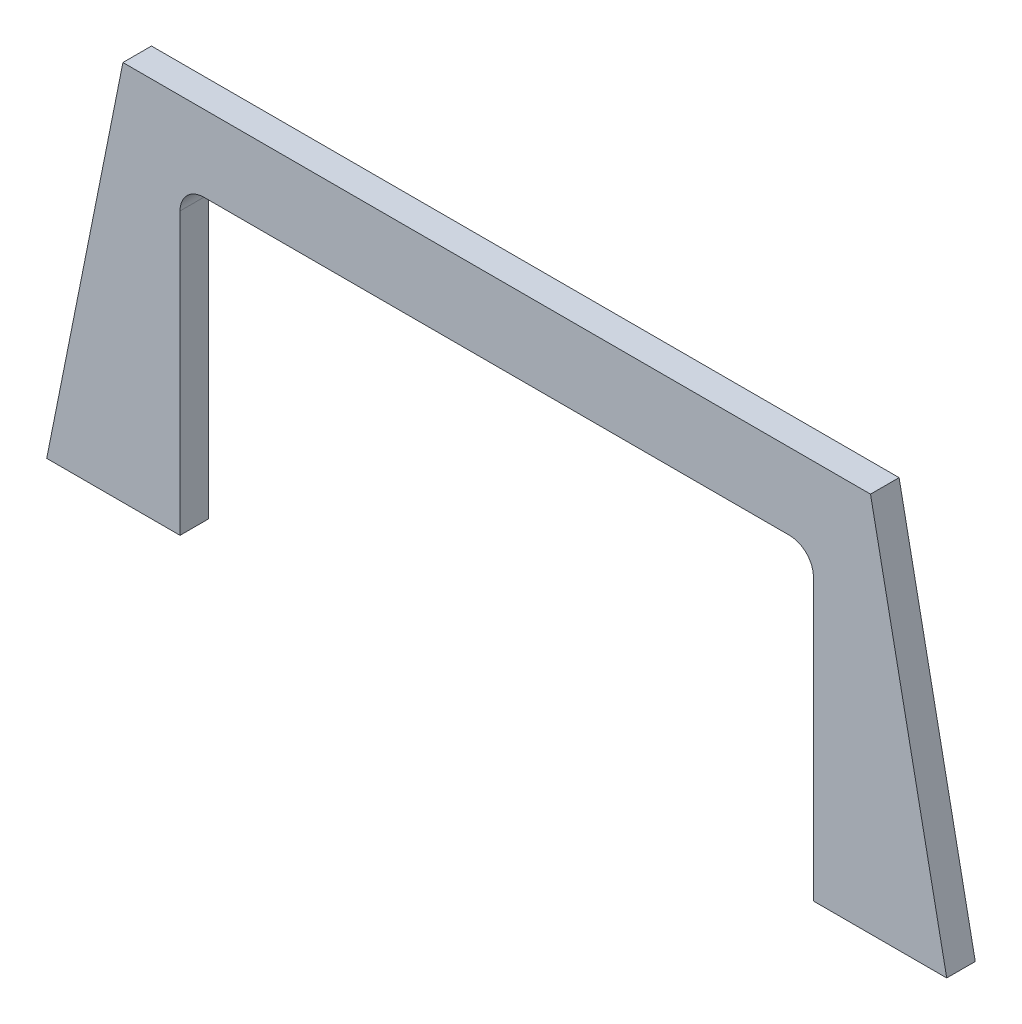
ISO-10303-21;
HEADER;
FILE_DESCRIPTION(('STEP AP214'),'2;1');
FILE_NAME('part.step','',(''),(''),'','','');
FILE_SCHEMA(('AUTOMOTIVE_DESIGN { 1 0 10303 214 1 1 1 1 }'));
ENDSEC;
DATA;
#1=APPLICATION_CONTEXT('core data for automotive mechanical design processes');
#2=APPLICATION_PROTOCOL_DEFINITION('international standard','automotive_design',2000,#1);
#3=PRODUCT_CONTEXT('',#1,'mechanical');
#4=PRODUCT('Part','Part','',(#3));
#5=PRODUCT_RELATED_PRODUCT_CATEGORY('part','',(#4));
#6=PRODUCT_DEFINITION_FORMATION('','',#4);
#7=PRODUCT_DEFINITION_CONTEXT('part definition',#1,'design');
#8=PRODUCT_DEFINITION('design','',#6,#7);
#9=PRODUCT_DEFINITION_SHAPE('','',#8);
#10=(LENGTH_UNIT() NAMED_UNIT(*) SI_UNIT(.MILLI.,.METRE.));
#11=(NAMED_UNIT(*) PLANE_ANGLE_UNIT() SI_UNIT($,.RADIAN.));
#12=(NAMED_UNIT(*) SI_UNIT($,.STERADIAN.) SOLID_ANGLE_UNIT());
#13=UNCERTAINTY_MEASURE_WITH_UNIT(LENGTH_MEASURE(1.E-05),#10,'distance_accuracy_value','');
#14=(GEOMETRIC_REPRESENTATION_CONTEXT(3) GLOBAL_UNCERTAINTY_ASSIGNED_CONTEXT((#13)) GLOBAL_UNIT_ASSIGNED_CONTEXT((#10,
#11,#12)) REPRESENTATION_CONTEXT('',''));
#15=CARTESIAN_POINT('',(0.,0.,0.));
#16=DIRECTION('',(0.,0.,1.));
#17=DIRECTION('',(1.,0.,0.));
#18=AXIS2_PLACEMENT_3D('',#15,#16,#17);
#19=CARTESIAN_POINT('',(61.5,19.,6.));
#20=DIRECTION('',(0.,0.,-1.));
#21=DIRECTION('',(-1.,0.,0.));
#22=AXIS2_PLACEMENT_3D('',#19,#20,#21);
#23=CYLINDRICAL_SURFACE('',#22,5.);
#24=CARTESIAN_POINT('',(61.5,19.,0.));
#25=DIRECTION('',(0.,0.,-1.));
#26=DIRECTION('',(-1.,0.,0.));
#27=AXIS2_PLACEMENT_3D('',#24,#25,#26);
#28=CIRCLE('',#27,5.);
#29=CARTESIAN_POINT('',(61.5,24.,0.));
#30=VERTEX_POINT('',#29);
#31=CARTESIAN_POINT('',(66.5,19.,0.));
#32=VERTEX_POINT('',#31);
#33=EDGE_CURVE('E140',#30,#32,#28,.T.);
#34=ORIENTED_EDGE('',*,*,#33,.T.);
#35=DIRECTION('',(0.,0.,-1.));
#36=VECTOR('',#35,1.);
#37=CARTESIAN_POINT('',(66.5,19.,6.));
#38=LINE('',#37,#36);
#39=CARTESIAN_POINT('',(66.5,19.,6.));
#40=VERTEX_POINT('',#39);
#41=EDGE_CURVE('E11',#40,#32,#38,.T.);
#42=ORIENTED_EDGE('',*,*,#41,.F.);
#43=CARTESIAN_POINT('',(61.5,19.,6.));
#44=DIRECTION('',(0.,0.,-1.));
#45=DIRECTION('',(-1.,0.,0.));
#46=AXIS2_PLACEMENT_3D('',#43,#44,#45);
#47=CIRCLE('',#46,5.);
#48=CARTESIAN_POINT('',(61.5,24.,6.));
#49=VERTEX_POINT('',#48);
#50=EDGE_CURVE('E158',#49,#40,#47,.T.);
#51=ORIENTED_EDGE('',*,*,#50,.F.);
#52=DIRECTION('',(0.,0.,-1.));
#53=VECTOR('',#52,1.);
#54=CARTESIAN_POINT('',(61.5,24.,6.));
#55=LINE('',#54,#53);
#56=EDGE_CURVE('E136',#49,#30,#55,.T.);
#57=ORIENTED_EDGE('',*,*,#56,.T.);
#58=EDGE_LOOP('',(#34,#42,#51,#57));
#59=FACE_BOUND('',#58,.T.);
#60=ADVANCED_FACE('F32',(#59),#23,.F.);
#61=CARTESIAN_POINT('',(66.5,-40.,6.));
#62=DIRECTION('',(1.,0.,0.));
#63=DIRECTION('',(0.,1.,0.));
#64=AXIS2_PLACEMENT_3D('',#61,#62,#63);
#65=PLANE('',#64);
#66=DIRECTION('',(0.,-1.,0.));
#67=VECTOR('',#66,1.);
#68=CARTESIAN_POINT('',(66.5,-40.,0.));
#69=LINE('',#68,#67);
#70=CARTESIAN_POINT('',(66.5,-40.,0.));
#71=VERTEX_POINT('',#70);
#72=EDGE_CURVE('E143',#32,#71,#69,.T.);
#73=ORIENTED_EDGE('',*,*,#72,.T.);
#74=DIRECTION('',(0.,0.,-1.));
#75=VECTOR('',#74,1.);
#76=CARTESIAN_POINT('',(66.5,-40.,6.));
#77=LINE('',#76,#75);
#78=CARTESIAN_POINT('',(66.5,-40.,6.));
#79=VERTEX_POINT('',#78);
#80=EDGE_CURVE('E40',#79,#71,#77,.T.);
#81=ORIENTED_EDGE('',*,*,#80,.F.);
#82=DIRECTION('',(0.,-1.,0.));
#83=VECTOR('',#82,1.);
#84=CARTESIAN_POINT('',(66.5,-40.,6.));
#85=LINE('',#84,#83);
#86=EDGE_CURVE('E97',#40,#79,#85,.T.);
#87=ORIENTED_EDGE('',*,*,#86,.F.);
#88=ORIENTED_EDGE('',*,*,#41,.T.);
#89=EDGE_LOOP('',(#73,#81,#87,#88));
#90=FACE_BOUND('',#89,.T.);
#91=ADVANCED_FACE('F207',(#90),#65,.F.);
#92=CARTESIAN_POINT('',(94.5,-40.,6.));
#93=DIRECTION('',(0.,1.,0.));
#94=DIRECTION('',(0.,0.,1.));
#95=AXIS2_PLACEMENT_3D('',#92,#93,#94);
#96=PLANE('',#95);
#97=DIRECTION('',(1.,0.,0.));
#98=VECTOR('',#97,1.);
#99=CARTESIAN_POINT('',(94.5,-40.,0.));
#100=LINE('',#99,#98);
#101=CARTESIAN_POINT('',(94.5,-40.,0.));
#102=VERTEX_POINT('',#101);
#103=EDGE_CURVE('E145',#71,#102,#100,.T.);
#104=ORIENTED_EDGE('',*,*,#103,.T.);
#105=DIRECTION('',(0.,0.,-1.));
#106=VECTOR('',#105,1.);
#107=CARTESIAN_POINT('',(94.5,-40.,6.));
#108=LINE('',#107,#106);
#109=CARTESIAN_POINT('',(94.5,-40.,6.));
#110=VERTEX_POINT('',#109);
#111=EDGE_CURVE('E171',#110,#102,#108,.T.);
#112=ORIENTED_EDGE('',*,*,#111,.F.);
#113=DIRECTION('',(1.,0.,0.));
#114=VECTOR('',#113,1.);
#115=CARTESIAN_POINT('',(94.5,-40.,6.));
#116=LINE('',#115,#114);
#117=EDGE_CURVE('E179',#79,#110,#116,.T.);
#118=ORIENTED_EDGE('',*,*,#117,.F.);
#119=ORIENTED_EDGE('',*,*,#80,.T.);
#120=EDGE_LOOP('',(#104,#112,#118,#119));
#121=FACE_BOUND('',#120,.T.);
#122=ADVANCED_FACE('F177',(#121),#96,.F.);
#123=CARTESIAN_POINT('',(78.5,40.,6.));
#124=DIRECTION('',(-0.98058067569092,-0.196116135138184,0.));
#125=DIRECTION('',(0.196116135138184,-0.98058067569092,0.));
#126=AXIS2_PLACEMENT_3D('',#123,#124,#125);
#127=PLANE('',#126);
#128=DIRECTION('',(-0.196116135138184,0.98058067569092,0.));
#129=VECTOR('',#128,1.);
#130=CARTESIAN_POINT('',(78.5,40.,0.));
#131=LINE('',#130,#129);
#132=CARTESIAN_POINT('',(78.5,40.,0.));
#133=VERTEX_POINT('',#132);
#134=EDGE_CURVE('E147',#102,#133,#131,.T.);
#135=ORIENTED_EDGE('',*,*,#134,.T.);
#136=DIRECTION('',(0.,0.,-1.));
#137=VECTOR('',#136,1.);
#138=CARTESIAN_POINT('',(78.5,40.,6.));
#139=LINE('',#138,#137);
#140=CARTESIAN_POINT('',(78.5,40.,6.));
#141=VERTEX_POINT('',#140);
#142=EDGE_CURVE('E168',#141,#133,#139,.T.);
#143=ORIENTED_EDGE('',*,*,#142,.F.);
#144=DIRECTION('',(-0.196116135138184,0.98058067569092,0.));
#145=VECTOR('',#144,1.);
#146=CARTESIAN_POINT('',(78.5,40.,6.));
#147=LINE('',#146,#145);
#148=EDGE_CURVE('E197',#110,#141,#147,.T.);
#149=ORIENTED_EDGE('',*,*,#148,.F.);
#150=ORIENTED_EDGE('',*,*,#111,.T.);
#151=EDGE_LOOP('',(#135,#143,#149,#150));
#152=FACE_BOUND('',#151,.T.);
#153=ADVANCED_FACE('F188',(#152),#127,.F.);
#154=CARTESIAN_POINT('',(-78.5,40.,6.));
#155=DIRECTION('',(0.,-1.,0.));
#156=DIRECTION('',(1.,0.,0.));
#157=AXIS2_PLACEMENT_3D('',#154,#155,#156);
#158=PLANE('',#157);
#159=DIRECTION('',(-1.,0.,0.));
#160=VECTOR('',#159,1.);
#161=CARTESIAN_POINT('',(-78.5,40.,0.));
#162=LINE('',#161,#160);
#163=CARTESIAN_POINT('',(-78.5,40.,0.));
#164=VERTEX_POINT('',#163);
#165=EDGE_CURVE('E149',#133,#164,#162,.T.);
#166=ORIENTED_EDGE('',*,*,#165,.T.);
#167=DIRECTION('',(0.,0.,-1.));
#168=VECTOR('',#167,1.);
#169=CARTESIAN_POINT('',(-78.5,40.,6.));
#170=LINE('',#169,#168);
#171=CARTESIAN_POINT('',(-78.5,40.,6.));
#172=VERTEX_POINT('',#171);
#173=EDGE_CURVE('E165',#172,#164,#170,.T.);
#174=ORIENTED_EDGE('',*,*,#173,.F.);
#175=DIRECTION('',(-1.,0.,0.));
#176=VECTOR('',#175,1.);
#177=CARTESIAN_POINT('',(-78.5,40.,6.));
#178=LINE('',#177,#176);
#179=EDGE_CURVE('E194',#141,#172,#178,.T.);
#180=ORIENTED_EDGE('',*,*,#179,.F.);
#181=ORIENTED_EDGE('',*,*,#142,.T.);
#182=EDGE_LOOP('',(#166,#174,#180,#181));
#183=FACE_BOUND('',#182,.T.);
#184=ADVANCED_FACE('F192',(#183),#158,.F.);
#185=CARTESIAN_POINT('',(-78.5,40.,6.));
#186=DIRECTION('',(0.98058067569092,-0.196116135138184,0.));
#187=DIRECTION('',(0.196116135138184,0.98058067569092,0.));
#188=AXIS2_PLACEMENT_3D('',#185,#186,#187);
#189=PLANE('',#188);
#190=DIRECTION('',(-0.196116135138184,-0.98058067569092,0.));
#191=VECTOR('',#190,1.);
#192=CARTESIAN_POINT('',(-78.5,40.,0.));
#193=LINE('',#192,#191);
#194=CARTESIAN_POINT('',(-94.5,-40.,0.));
#195=VERTEX_POINT('',#194);
#196=EDGE_CURVE('E151',#164,#195,#193,.T.);
#197=ORIENTED_EDGE('',*,*,#196,.T.);
#198=DIRECTION('',(0.,0.,-1.));
#199=VECTOR('',#198,1.);
#200=CARTESIAN_POINT('',(-94.5,-40.,6.));
#201=LINE('',#200,#199);
#202=CARTESIAN_POINT('',(-94.5,-40.,6.));
#203=VERTEX_POINT('',#202);
#204=EDGE_CURVE('E162',#203,#195,#201,.T.);
#205=ORIENTED_EDGE('',*,*,#204,.F.);
#206=DIRECTION('',(-0.196116135138184,-0.98058067569092,0.));
#207=VECTOR('',#206,1.);
#208=CARTESIAN_POINT('',(-78.5,40.,6.));
#209=LINE('',#208,#207);
#210=EDGE_CURVE('E196',#172,#203,#209,.T.);
#211=ORIENTED_EDGE('',*,*,#210,.F.);
#212=ORIENTED_EDGE('',*,*,#173,.T.);
#213=EDGE_LOOP('',(#197,#205,#211,#212));
#214=FACE_BOUND('',#213,.T.);
#215=ADVANCED_FACE('F219',(#214),#189,.F.);
#216=CARTESIAN_POINT('',(-66.5,-40.,6.));
#217=DIRECTION('',(0.,1.,0.));
#218=DIRECTION('',(0.,0.,1.));
#219=AXIS2_PLACEMENT_3D('',#216,#217,#218);
#220=PLANE('',#219);
#221=DIRECTION('',(1.,0.,0.));
#222=VECTOR('',#221,1.);
#223=CARTESIAN_POINT('',(-66.5,-40.,0.));
#224=LINE('',#223,#222);
#225=CARTESIAN_POINT('',(-66.5,-40.,0.));
#226=VERTEX_POINT('',#225);
#227=EDGE_CURVE('E153',#195,#226,#224,.T.);
#228=ORIENTED_EDGE('',*,*,#227,.T.);
#229=DIRECTION('',(0.,0.,-1.));
#230=VECTOR('',#229,1.);
#231=CARTESIAN_POINT('',(-66.5,-40.,6.));
#232=LINE('',#231,#230);
#233=CARTESIAN_POINT('',(-66.5,-40.,6.));
#234=VERTEX_POINT('',#233);
#235=EDGE_CURVE('E131',#234,#226,#232,.T.);
#236=ORIENTED_EDGE('',*,*,#235,.F.);
#237=DIRECTION('',(1.,0.,0.));
#238=VECTOR('',#237,1.);
#239=CARTESIAN_POINT('',(-66.5,-40.,6.));
#240=LINE('',#239,#238);
#241=EDGE_CURVE('E122',#203,#234,#240,.T.);
#242=ORIENTED_EDGE('',*,*,#241,.F.);
#243=ORIENTED_EDGE('',*,*,#204,.T.);
#244=EDGE_LOOP('',(#228,#236,#242,#243));
#245=FACE_BOUND('',#244,.T.);
#246=ADVANCED_FACE('F222',(#245),#220,.F.);
#247=CARTESIAN_POINT('',(-66.5,-40.,6.));
#248=DIRECTION('',(-1.,0.,0.));
#249=DIRECTION('',(0.,-1.,0.));
#250=AXIS2_PLACEMENT_3D('',#247,#248,#249);
#251=PLANE('',#250);
#252=DIRECTION('',(0.,1.,0.));
#253=VECTOR('',#252,1.);
#254=CARTESIAN_POINT('',(-66.5,-40.,0.));
#255=LINE('',#254,#253);
#256=CARTESIAN_POINT('',(-66.5,19.,0.));
#257=VERTEX_POINT('',#256);
#258=EDGE_CURVE('E130',#226,#257,#255,.T.);
#259=ORIENTED_EDGE('',*,*,#258,.T.);
#260=DIRECTION('',(0.,0.,-1.));
#261=VECTOR('',#260,1.);
#262=CARTESIAN_POINT('',(-66.5,19.,6.));
#263=LINE('',#262,#261);
#264=CARTESIAN_POINT('',(-66.5,19.,6.));
#265=VERTEX_POINT('',#264);
#266=EDGE_CURVE('E127',#265,#257,#263,.T.);
#267=ORIENTED_EDGE('',*,*,#266,.F.);
#268=DIRECTION('',(0.,1.,0.));
#269=VECTOR('',#268,1.);
#270=CARTESIAN_POINT('',(-66.5,-40.,6.));
#271=LINE('',#270,#269);
#272=EDGE_CURVE('E116',#234,#265,#271,.T.);
#273=ORIENTED_EDGE('',*,*,#272,.F.);
#274=ORIENTED_EDGE('',*,*,#235,.T.);
#275=EDGE_LOOP('',(#259,#267,#273,#274));
#276=FACE_BOUND('',#275,.T.);
#277=ADVANCED_FACE('F128',(#276),#251,.F.);
#278=CARTESIAN_POINT('',(-61.5,19.,6.));
#279=DIRECTION('',(0.,0.,-1.));
#280=DIRECTION('',(-1.,0.,0.));
#281=AXIS2_PLACEMENT_3D('',#278,#279,#280);
#282=CYLINDRICAL_SURFACE('',#281,5.);
#283=CARTESIAN_POINT('',(-61.5,19.,0.));
#284=DIRECTION('',(0.,0.,-1.));
#285=DIRECTION('',(1.,0.,0.));
#286=AXIS2_PLACEMENT_3D('',#283,#284,#285);
#287=CIRCLE('',#286,5.);
#288=CARTESIAN_POINT('',(-61.4999999999999,24.,0.));
#289=VERTEX_POINT('',#288);
#290=EDGE_CURVE('E83',#257,#289,#287,.T.);
#291=ORIENTED_EDGE('',*,*,#290,.T.);
#292=DIRECTION('',(0.,0.,-1.));
#293=VECTOR('',#292,1.);
#294=CARTESIAN_POINT('',(-61.4999999999999,24.,6.));
#295=LINE('',#294,#293);
#296=CARTESIAN_POINT('',(-61.4999999999999,24.,6.));
#297=VERTEX_POINT('',#296);
#298=EDGE_CURVE('E132',#297,#289,#295,.T.);
#299=ORIENTED_EDGE('',*,*,#298,.F.);
#300=CARTESIAN_POINT('',(-61.5,19.,6.));
#301=DIRECTION('',(0.,0.,-1.));
#302=DIRECTION('',(1.,0.,0.));
#303=AXIS2_PLACEMENT_3D('',#300,#301,#302);
#304=CIRCLE('',#303,5.);
#305=EDGE_CURVE('E120',#265,#297,#304,.T.);
#306=ORIENTED_EDGE('',*,*,#305,.F.);
#307=ORIENTED_EDGE('',*,*,#266,.T.);
#308=EDGE_LOOP('',(#291,#299,#306,#307));
#309=FACE_BOUND('',#308,.T.);
#310=ADVANCED_FACE('F134',(#309),#282,.F.);
#311=CARTESIAN_POINT('',(61.5,24.,6.));
#312=DIRECTION('',(0.,1.,0.));
#313=DIRECTION('',(-1.,0.,0.));
#314=AXIS2_PLACEMENT_3D('',#311,#312,#313);
#315=PLANE('',#314);
#316=DIRECTION('',(1.,0.,0.));
#317=VECTOR('',#316,1.);
#318=CARTESIAN_POINT('',(61.5,24.,0.));
#319=LINE('',#318,#317);
#320=EDGE_CURVE('E89',#289,#30,#319,.T.);
#321=ORIENTED_EDGE('',*,*,#320,.T.);
#322=ORIENTED_EDGE('',*,*,#56,.F.);
#323=DIRECTION('',(1.,0.,0.));
#324=VECTOR('',#323,1.);
#325=CARTESIAN_POINT('',(61.5,24.,6.));
#326=LINE('',#325,#324);
#327=EDGE_CURVE('E48',#297,#49,#326,.T.);
#328=ORIENTED_EDGE('',*,*,#327,.F.);
#329=ORIENTED_EDGE('',*,*,#298,.T.);
#330=EDGE_LOOP('',(#321,#322,#328,#329));
#331=FACE_BOUND('',#330,.T.);
#332=ADVANCED_FACE('F231',(#331),#315,.F.);
#333=CARTESIAN_POINT('',(61.5,19.,6.));
#334=DIRECTION('',(0.,0.,-1.));
#335=DIRECTION('',(-1.,0.,0.));
#336=AXIS2_PLACEMENT_3D('',#333,#334,#335);
#337=PLANE('',#336);
#338=ORIENTED_EDGE('',*,*,#50,.T.);
#339=ORIENTED_EDGE('',*,*,#86,.T.);
#340=ORIENTED_EDGE('',*,*,#117,.T.);
#341=ORIENTED_EDGE('',*,*,#148,.T.);
#342=ORIENTED_EDGE('',*,*,#179,.T.);
#343=ORIENTED_EDGE('',*,*,#210,.T.);
#344=ORIENTED_EDGE('',*,*,#241,.T.);
#345=ORIENTED_EDGE('',*,*,#272,.T.);
#346=ORIENTED_EDGE('',*,*,#305,.T.);
#347=ORIENTED_EDGE('',*,*,#327,.T.);
#348=EDGE_LOOP('',(#338,#339,#340,#341,#342,#343,#344,#345,#346,#347));
#349=FACE_BOUND('',#348,.T.);
#350=ADVANCED_FACE('F118',(#349),#337,.F.);
#351=CARTESIAN_POINT('',(61.5,19.,0.));
#352=DIRECTION('',(0.,0.,-1.));
#353=DIRECTION('',(-1.,0.,0.));
#354=AXIS2_PLACEMENT_3D('',#351,#352,#353);
#355=PLANE('',#354);
#356=ORIENTED_EDGE('',*,*,#33,.F.);
#357=ORIENTED_EDGE('',*,*,#320,.F.);
#358=ORIENTED_EDGE('',*,*,#290,.F.);
#359=ORIENTED_EDGE('',*,*,#258,.F.);
#360=ORIENTED_EDGE('',*,*,#227,.F.);
#361=ORIENTED_EDGE('',*,*,#196,.F.);
#362=ORIENTED_EDGE('',*,*,#165,.F.);
#363=ORIENTED_EDGE('',*,*,#134,.F.);
#364=ORIENTED_EDGE('',*,*,#103,.F.);
#365=ORIENTED_EDGE('',*,*,#72,.F.);
#366=EDGE_LOOP('',(#356,#357,#358,#359,#360,#361,#362,#363,#364,#365));
#367=FACE_BOUND('',#366,.T.);
#368=ADVANCED_FACE('F183',(#367),#355,.T.);
#369=CLOSED_SHELL('',(#60,#91,#122,#153,#184,#215,#246,#277,#310,#332,#350,#368));
#370=MANIFOLD_SOLID_BREP('B2',#369);
#371=ADVANCED_BREP_SHAPE_REPRESENTATION('',(#18,#370),#14);
#372=SHAPE_DEFINITION_REPRESENTATION(#9,#371);
ENDSEC;
END-ISO-10303-21;
